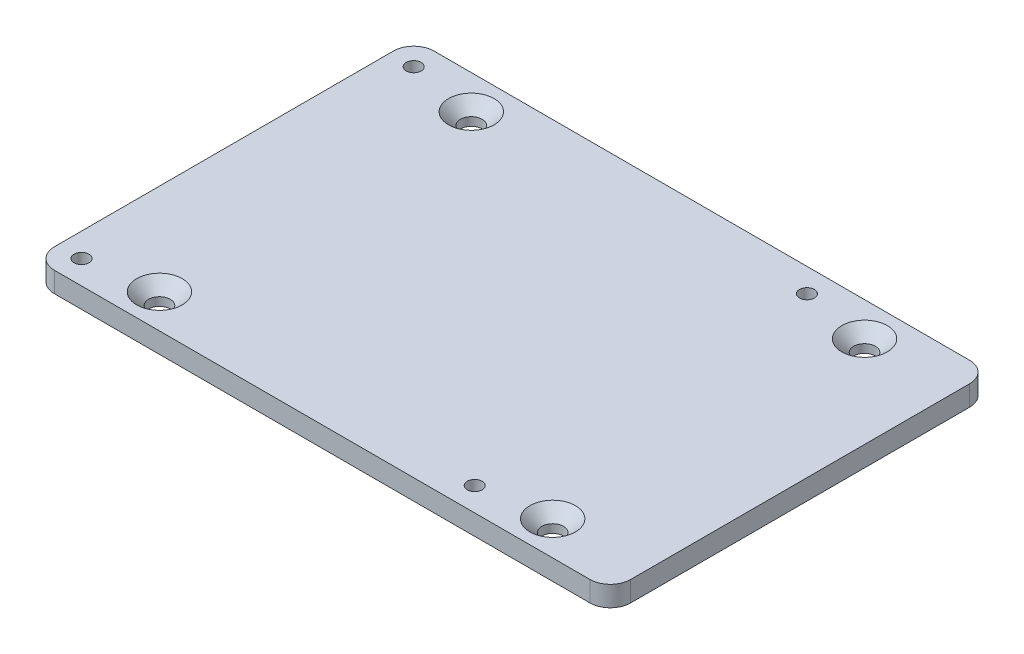
ISO-10303-21;
HEADER;
FILE_DESCRIPTION(('STEP AP214'),'2;1');
FILE_NAME('part.step','',(''),(''),'','','');
FILE_SCHEMA(('AUTOMOTIVE_DESIGN { 1 0 10303 214 1 1 1 1 }'));
ENDSEC;
DATA;
#1=APPLICATION_CONTEXT('core data for automotive mechanical design processes');
#2=APPLICATION_PROTOCOL_DEFINITION('international standard','automotive_design',2000,#1);
#3=PRODUCT_CONTEXT('',#1,'mechanical');
#4=PRODUCT('Part','Part','',(#3));
#5=PRODUCT_RELATED_PRODUCT_CATEGORY('part','',(#4));
#6=PRODUCT_DEFINITION_FORMATION('','',#4);
#7=PRODUCT_DEFINITION_CONTEXT('part definition',#1,'design');
#8=PRODUCT_DEFINITION('design','',#6,#7);
#9=PRODUCT_DEFINITION_SHAPE('','',#8);
#10=(LENGTH_UNIT() NAMED_UNIT(*) SI_UNIT(.MILLI.,.METRE.));
#11=(NAMED_UNIT(*) PLANE_ANGLE_UNIT() SI_UNIT($,.RADIAN.));
#12=(NAMED_UNIT(*) SI_UNIT($,.STERADIAN.) SOLID_ANGLE_UNIT());
#13=UNCERTAINTY_MEASURE_WITH_UNIT(LENGTH_MEASURE(1.E-05),#10,'distance_accuracy_value','');
#14=(GEOMETRIC_REPRESENTATION_CONTEXT(3) GLOBAL_UNCERTAINTY_ASSIGNED_CONTEXT((#13)) GLOBAL_UNIT_ASSIGNED_CONTEXT((#10,
#11,#12)) REPRESENTATION_CONTEXT('',''));
#15=CARTESIAN_POINT('',(0.,0.,0.));
#16=DIRECTION('',(0.,0.,1.));
#17=DIRECTION('',(1.,0.,0.));
#18=AXIS2_PLACEMENT_3D('',#15,#16,#17);
#19=CARTESIAN_POINT('',(-42.5,3.,28.));
#20=DIRECTION('',(1.,0.,0.));
#21=DIRECTION('',(0.,0.,-1.));
#22=AXIS2_PLACEMENT_3D('',#19,#20,#21);
#23=PLANE('',#22);
#24=DIRECTION('',(0.,0.,1.));
#25=VECTOR('',#24,1.);
#26=CARTESIAN_POINT('',(-42.5,0.,28.));
#27=LINE('',#26,#25);
#28=CARTESIAN_POINT('',(-42.5,0.,-25.));
#29=VERTEX_POINT('',#28);
#30=CARTESIAN_POINT('',(-42.5,0.,25.));
#31=VERTEX_POINT('',#30);
#32=EDGE_CURVE('E170',#29,#31,#27,.T.);
#33=ORIENTED_EDGE('',*,*,#32,.T.);
#34=DIRECTION('',(0.,-1.,0.));
#35=VECTOR('',#34,1.);
#36=CARTESIAN_POINT('',(-42.5,3.,25.));
#37=LINE('',#36,#35);
#38=CARTESIAN_POINT('',(-42.5,3.,25.));
#39=VERTEX_POINT('',#38);
#40=EDGE_CURVE('E11',#31,#39,#37,.F.);
#41=ORIENTED_EDGE('',*,*,#40,.T.);
#42=DIRECTION('',(0.,0.,1.));
#43=VECTOR('',#42,1.);
#44=CARTESIAN_POINT('',(-42.5,3.,28.));
#45=LINE('',#44,#43);
#46=CARTESIAN_POINT('',(-42.5,3.,-25.));
#47=VERTEX_POINT('',#46);
#48=EDGE_CURVE('E128',#47,#39,#45,.T.);
#49=ORIENTED_EDGE('',*,*,#48,.F.);
#50=DIRECTION('',(0.,-1.,0.));
#51=VECTOR('',#50,1.);
#52=CARTESIAN_POINT('',(-42.5,3.,-25.));
#53=LINE('',#52,#51);
#54=EDGE_CURVE('E44',#47,#29,#53,.T.);
#55=ORIENTED_EDGE('',*,*,#54,.T.);
#56=EDGE_LOOP('',(#33,#41,#49,#55));
#57=FACE_BOUND('',#56,.T.);
#58=ADVANCED_FACE('F36',(#57),#23,.F.);
#59=CARTESIAN_POINT('',(42.5,3.,28.));
#60=DIRECTION('',(0.,0.,-1.));
#61=DIRECTION('',(-1.,0.,0.));
#62=AXIS2_PLACEMENT_3D('',#59,#60,#61);
#63=PLANE('',#62);
#64=DIRECTION('',(1.,0.,0.));
#65=VECTOR('',#64,1.);
#66=CARTESIAN_POINT('',(42.5,0.,28.));
#67=LINE('',#66,#65);
#68=CARTESIAN_POINT('',(-39.5,0.,28.));
#69=VERTEX_POINT('',#68);
#70=CARTESIAN_POINT('',(39.5,0.,28.));
#71=VERTEX_POINT('',#70);
#72=EDGE_CURVE('E133',#69,#71,#67,.T.);
#73=ORIENTED_EDGE('',*,*,#72,.T.);
#74=DIRECTION('',(0.,-1.,0.));
#75=VECTOR('',#74,1.);
#76=CARTESIAN_POINT('',(39.5,3.,28.));
#77=LINE('',#76,#75);
#78=CARTESIAN_POINT('',(39.5,3.,28.));
#79=VERTEX_POINT('',#78);
#80=EDGE_CURVE('E51',#71,#79,#77,.F.);
#81=ORIENTED_EDGE('',*,*,#80,.T.);
#82=DIRECTION('',(1.,0.,0.));
#83=VECTOR('',#82,1.);
#84=CARTESIAN_POINT('',(42.5,3.,28.));
#85=LINE('',#84,#83);
#86=CARTESIAN_POINT('',(-39.5,3.,28.));
#87=VERTEX_POINT('',#86);
#88=EDGE_CURVE('E131',#87,#79,#85,.T.);
#89=ORIENTED_EDGE('',*,*,#88,.F.);
#90=DIRECTION('',(0.,-1.,0.));
#91=VECTOR('',#90,1.);
#92=CARTESIAN_POINT('',(-39.5,3.,28.));
#93=LINE('',#92,#91);
#94=EDGE_CURVE('E162',#87,#69,#93,.T.);
#95=ORIENTED_EDGE('',*,*,#94,.T.);
#96=EDGE_LOOP('',(#73,#81,#89,#95));
#97=FACE_BOUND('',#96,.T.);
#98=ADVANCED_FACE('F259',(#97),#63,.F.);
#99=CARTESIAN_POINT('',(42.5,3.,28.));
#100=DIRECTION('',(-1.,0.,0.));
#101=DIRECTION('',(0.,0.,1.));
#102=AXIS2_PLACEMENT_3D('',#99,#100,#101);
#103=PLANE('',#102);
#104=DIRECTION('',(0.,0.,-1.));
#105=VECTOR('',#104,1.);
#106=CARTESIAN_POINT('',(42.5,0.,28.));
#107=LINE('',#106,#105);
#108=CARTESIAN_POINT('',(42.5,0.,25.));
#109=VERTEX_POINT('',#108);
#110=CARTESIAN_POINT('',(42.5,0.,-25.));
#111=VERTEX_POINT('',#110);
#112=EDGE_CURVE('E129',#109,#111,#107,.T.);
#113=ORIENTED_EDGE('',*,*,#112,.T.);
#114=DIRECTION('',(0.,-1.,0.));
#115=VECTOR('',#114,1.);
#116=CARTESIAN_POINT('',(42.5,3.,-25.));
#117=LINE('',#116,#115);
#118=CARTESIAN_POINT('',(42.5,3.,-25.));
#119=VERTEX_POINT('',#118);
#120=EDGE_CURVE('E107',#111,#119,#117,.F.);
#121=ORIENTED_EDGE('',*,*,#120,.T.);
#122=DIRECTION('',(0.,0.,-1.));
#123=VECTOR('',#122,1.);
#124=CARTESIAN_POINT('',(42.5,3.,28.));
#125=LINE('',#124,#123);
#126=CARTESIAN_POINT('',(42.5,3.,25.));
#127=VERTEX_POINT('',#126);
#128=EDGE_CURVE('E181',#127,#119,#125,.T.);
#129=ORIENTED_EDGE('',*,*,#128,.F.);
#130=DIRECTION('',(0.,-1.,0.));
#131=VECTOR('',#130,1.);
#132=CARTESIAN_POINT('',(42.5,3.,25.));
#133=LINE('',#132,#131);
#134=EDGE_CURVE('E112',#127,#109,#133,.T.);
#135=ORIENTED_EDGE('',*,*,#134,.T.);
#136=EDGE_LOOP('',(#113,#121,#129,#135));
#137=FACE_BOUND('',#136,.T.);
#138=ADVANCED_FACE('F256',(#137),#103,.F.);
#139=CARTESIAN_POINT('',(42.5,3.,-28.));
#140=DIRECTION('',(0.,0.,1.));
#141=DIRECTION('',(1.,0.,0.));
#142=AXIS2_PLACEMENT_3D('',#139,#140,#141);
#143=PLANE('',#142);
#144=DIRECTION('',(-1.,0.,0.));
#145=VECTOR('',#144,1.);
#146=CARTESIAN_POINT('',(42.5,3.,-28.));
#147=LINE('',#146,#145);
#148=CARTESIAN_POINT('',(39.5,3.,-28.));
#149=VERTEX_POINT('',#148);
#150=CARTESIAN_POINT('',(-39.5,3.,-28.));
#151=VERTEX_POINT('',#150);
#152=EDGE_CURVE('E122',#149,#151,#147,.T.);
#153=ORIENTED_EDGE('',*,*,#152,.F.);
#154=DIRECTION('',(0.,-1.,0.));
#155=VECTOR('',#154,1.);
#156=CARTESIAN_POINT('',(39.5,3.,-28.));
#157=LINE('',#156,#155);
#158=CARTESIAN_POINT('',(39.5,0.,-28.));
#159=VERTEX_POINT('',#158);
#160=EDGE_CURVE('E106',#149,#159,#157,.T.);
#161=ORIENTED_EDGE('',*,*,#160,.T.);
#162=DIRECTION('',(-1.,0.,0.));
#163=VECTOR('',#162,1.);
#164=CARTESIAN_POINT('',(42.5,0.,-28.));
#165=LINE('',#164,#163);
#166=CARTESIAN_POINT('',(-39.5,0.,-28.));
#167=VERTEX_POINT('',#166);
#168=EDGE_CURVE('E119',#159,#167,#165,.T.);
#169=ORIENTED_EDGE('',*,*,#168,.T.);
#170=DIRECTION('',(0.,-1.,0.));
#171=VECTOR('',#170,1.);
#172=CARTESIAN_POINT('',(-39.5,3.,-28.));
#173=LINE('',#172,#171);
#174=EDGE_CURVE('E124',#167,#151,#173,.F.);
#175=ORIENTED_EDGE('',*,*,#174,.T.);
#176=EDGE_LOOP('',(#153,#161,#169,#175));
#177=FACE_BOUND('',#176,.T.);
#178=ADVANCED_FACE('F118',(#177),#143,.F.);
#179=CARTESIAN_POINT('',(0.,3.,0.));
#180=DIRECTION('',(0.,1.,0.));
#181=DIRECTION('',(0.,0.,1.));
#182=AXIS2_PLACEMENT_3D('',#179,#180,#181);
#183=PLANE('',#182);
#184=CARTESIAN_POINT('',(-29.,3.,-23.));
#185=DIRECTION('',(0.,1.,0.));
#186=DIRECTION('',(0.,0.,1.));
#187=AXIS2_PLACEMENT_3D('',#184,#185,#186);
#188=CIRCLE('',#187,3.36);
#189=CARTESIAN_POINT('',(-29.,3.,-19.64));
#190=VERTEX_POINT('',#189);
#191=EDGE_CURVE('E229',#190,#190,#188,.T.);
#192=ORIENTED_EDGE('',*,*,#191,.F.);
#193=EDGE_LOOP('',(#192));
#194=FACE_BOUND('',#193,.T.);
#195=CARTESIAN_POINT('',(29.,3.,23.));
#196=DIRECTION('',(0.,1.,0.));
#197=DIRECTION('',(0.,0.,1.));
#198=AXIS2_PLACEMENT_3D('',#195,#196,#197);
#199=CIRCLE('',#198,3.36);
#200=CARTESIAN_POINT('',(29.,3.,26.36));
#201=VERTEX_POINT('',#200);
#202=EDGE_CURVE('E220',#201,#201,#199,.T.);
#203=ORIENTED_EDGE('',*,*,#202,.F.);
#204=EDGE_LOOP('',(#203));
#205=FACE_BOUND('',#204,.T.);
#206=CARTESIAN_POINT('',(-29.,3.,23.));
#207=DIRECTION('',(0.,1.,0.));
#208=DIRECTION('',(0.,0.,1.));
#209=AXIS2_PLACEMENT_3D('',#206,#207,#208);
#210=CIRCLE('',#209,3.36);
#211=CARTESIAN_POINT('',(-29.,3.,26.36));
#212=VERTEX_POINT('',#211);
#213=EDGE_CURVE('E211',#212,#212,#210,.T.);
#214=ORIENTED_EDGE('',*,*,#213,.F.);
#215=EDGE_LOOP('',(#214));
#216=FACE_BOUND('',#215,.T.);
#217=CARTESIAN_POINT('',(29.,3.,-23.));
#218=DIRECTION('',(0.,1.,0.));
#219=DIRECTION('',(0.,0.,1.));
#220=AXIS2_PLACEMENT_3D('',#217,#218,#219);
#221=CIRCLE('',#220,3.36);
#222=CARTESIAN_POINT('',(29.,3.,-19.64));
#223=VERTEX_POINT('',#222);
#224=EDGE_CURVE('E202',#223,#223,#221,.T.);
#225=ORIENTED_EDGE('',*,*,#224,.F.);
#226=EDGE_LOOP('',(#225));
#227=FACE_BOUND('',#226,.T.);
#228=CARTESIAN_POINT('',(-39.,3.,-24.5));
#229=DIRECTION('',(0.,1.,0.));
#230=DIRECTION('',(0.,0.,1.));
#231=AXIS2_PLACEMENT_3D('',#228,#229,#230);
#232=CIRCLE('',#231,1.1);
#233=CARTESIAN_POINT('',(-39.,3.,-23.4));
#234=VERTEX_POINT('',#233);
#235=EDGE_CURVE('E146',#234,#234,#232,.T.);
#236=ORIENTED_EDGE('',*,*,#235,.F.);
#237=EDGE_LOOP('',(#236));
#238=FACE_BOUND('',#237,.T.);
#239=CARTESIAN_POINT('',(19.,3.,24.5));
#240=DIRECTION('',(0.,1.,0.));
#241=DIRECTION('',(0.,0.,1.));
#242=AXIS2_PLACEMENT_3D('',#239,#240,#241);
#243=CIRCLE('',#242,1.1);
#244=CARTESIAN_POINT('',(19.,3.,25.6));
#245=VERTEX_POINT('',#244);
#246=EDGE_CURVE('E145',#245,#245,#243,.T.);
#247=ORIENTED_EDGE('',*,*,#246,.F.);
#248=EDGE_LOOP('',(#247));
#249=FACE_BOUND('',#248,.T.);
#250=CARTESIAN_POINT('',(19.,3.,-24.5));
#251=DIRECTION('',(0.,1.,0.));
#252=DIRECTION('',(0.,0.,1.));
#253=AXIS2_PLACEMENT_3D('',#250,#251,#252);
#254=CIRCLE('',#253,1.1);
#255=CARTESIAN_POINT('',(19.,3.,-23.4));
#256=VERTEX_POINT('',#255);
#257=EDGE_CURVE('E141',#256,#256,#254,.T.);
#258=ORIENTED_EDGE('',*,*,#257,.F.);
#259=EDGE_LOOP('',(#258));
#260=FACE_BOUND('',#259,.T.);
#261=CARTESIAN_POINT('',(-39.,3.,24.5));
#262=DIRECTION('',(0.,1.,0.));
#263=DIRECTION('',(0.,0.,1.));
#264=AXIS2_PLACEMENT_3D('',#261,#262,#263);
#265=CIRCLE('',#264,1.1);
#266=CARTESIAN_POINT('',(-39.,3.,25.6));
#267=VERTEX_POINT('',#266);
#268=EDGE_CURVE('E140',#267,#267,#265,.T.);
#269=ORIENTED_EDGE('',*,*,#268,.F.);
#270=EDGE_LOOP('',(#269));
#271=FACE_BOUND('',#270,.T.);
#272=ORIENTED_EDGE('',*,*,#128,.T.);
#273=CARTESIAN_POINT('',(39.5,3.,-25.));
#274=DIRECTION('',(0.,1.,0.));
#275=DIRECTION('',(0.,0.,1.));
#276=AXIS2_PLACEMENT_3D('',#273,#274,#275);
#277=CIRCLE('',#276,3.);
#278=EDGE_CURVE('E160',#119,#149,#277,.T.);
#279=ORIENTED_EDGE('',*,*,#278,.T.);
#280=ORIENTED_EDGE('',*,*,#152,.T.);
#281=CARTESIAN_POINT('',(-39.5,3.,-25.));
#282=DIRECTION('',(0.,1.,0.));
#283=DIRECTION('',(0.,0.,1.));
#284=AXIS2_PLACEMENT_3D('',#281,#282,#283);
#285=CIRCLE('',#284,3.);
#286=EDGE_CURVE('E155',#151,#47,#285,.T.);
#287=ORIENTED_EDGE('',*,*,#286,.T.);
#288=ORIENTED_EDGE('',*,*,#48,.T.);
#289=CARTESIAN_POINT('',(-39.5,3.,25.));
#290=DIRECTION('',(0.,1.,0.));
#291=DIRECTION('',(0.,0.,1.));
#292=AXIS2_PLACEMENT_3D('',#289,#290,#291);
#293=CIRCLE('',#292,3.);
#294=EDGE_CURVE('E58',#39,#87,#293,.T.);
#295=ORIENTED_EDGE('',*,*,#294,.T.);
#296=ORIENTED_EDGE('',*,*,#88,.T.);
#297=CARTESIAN_POINT('',(39.5,3.,25.));
#298=DIRECTION('',(0.,1.,0.));
#299=DIRECTION('',(0.,0.,1.));
#300=AXIS2_PLACEMENT_3D('',#297,#298,#299);
#301=CIRCLE('',#300,3.);
#302=EDGE_CURVE('E158',#79,#127,#301,.T.);
#303=ORIENTED_EDGE('',*,*,#302,.T.);
#304=EDGE_LOOP('',(#272,#279,#280,#287,#288,#295,#296,#303));
#305=FACE_BOUND('',#304,.T.);
#306=ADVANCED_FACE('F235',(#194,#205,#216,#227,#238,#249,#260,#271,#305),#183,.T.);
#307=CARTESIAN_POINT('',(0.,0.,0.));
#308=DIRECTION('',(0.,1.,0.));
#309=DIRECTION('',(0.,0.,1.));
#310=AXIS2_PLACEMENT_3D('',#307,#308,#309);
#311=PLANE('',#310);
#312=CARTESIAN_POINT('',(-29.,0.,-23.));
#313=DIRECTION('',(0.,1.,0.));
#314=DIRECTION('',(0.,0.,1.));
#315=AXIS2_PLACEMENT_3D('',#312,#313,#314);
#316=CIRCLE('',#315,1.6);
#317=CARTESIAN_POINT('',(-29.,0.,-21.4));
#318=VERTEX_POINT('',#317);
#319=EDGE_CURVE('E223',#318,#318,#316,.T.);
#320=ORIENTED_EDGE('',*,*,#319,.T.);
#321=EDGE_LOOP('',(#320));
#322=FACE_BOUND('',#321,.T.);
#323=CARTESIAN_POINT('',(29.,0.,23.));
#324=DIRECTION('',(0.,1.,0.));
#325=DIRECTION('',(0.,0.,1.));
#326=AXIS2_PLACEMENT_3D('',#323,#324,#325);
#327=CIRCLE('',#326,1.6);
#328=CARTESIAN_POINT('',(29.,0.,24.6));
#329=VERTEX_POINT('',#328);
#330=EDGE_CURVE('E214',#329,#329,#327,.T.);
#331=ORIENTED_EDGE('',*,*,#330,.T.);
#332=EDGE_LOOP('',(#331));
#333=FACE_BOUND('',#332,.T.);
#334=CARTESIAN_POINT('',(-29.,0.,23.));
#335=DIRECTION('',(0.,1.,0.));
#336=DIRECTION('',(0.,0.,1.));
#337=AXIS2_PLACEMENT_3D('',#334,#335,#336);
#338=CIRCLE('',#337,1.6);
#339=CARTESIAN_POINT('',(-29.,0.,24.6));
#340=VERTEX_POINT('',#339);
#341=EDGE_CURVE('E205',#340,#340,#338,.T.);
#342=ORIENTED_EDGE('',*,*,#341,.T.);
#343=EDGE_LOOP('',(#342));
#344=FACE_BOUND('',#343,.T.);
#345=CARTESIAN_POINT('',(29.,0.,-23.));
#346=DIRECTION('',(0.,1.,0.));
#347=DIRECTION('',(0.,0.,1.));
#348=AXIS2_PLACEMENT_3D('',#345,#346,#347);
#349=CIRCLE('',#348,1.6);
#350=CARTESIAN_POINT('',(29.,0.,-21.4));
#351=VERTEX_POINT('',#350);
#352=EDGE_CURVE('E196',#351,#351,#349,.T.);
#353=ORIENTED_EDGE('',*,*,#352,.T.);
#354=EDGE_LOOP('',(#353));
#355=FACE_BOUND('',#354,.T.);
#356=CARTESIAN_POINT('',(-39.,0.,-24.5));
#357=DIRECTION('',(0.,1.,0.));
#358=DIRECTION('',(0.,0.,1.));
#359=AXIS2_PLACEMENT_3D('',#356,#357,#358);
#360=CIRCLE('',#359,1.1);
#361=CARTESIAN_POINT('',(-39.,0.,-23.4));
#362=VERTEX_POINT('',#361);
#363=EDGE_CURVE('E142',#362,#362,#360,.T.);
#364=ORIENTED_EDGE('',*,*,#363,.T.);
#365=EDGE_LOOP('',(#364));
#366=FACE_BOUND('',#365,.T.);
#367=CARTESIAN_POINT('',(19.,0.,24.5));
#368=DIRECTION('',(0.,1.,0.));
#369=DIRECTION('',(0.,0.,1.));
#370=AXIS2_PLACEMENT_3D('',#367,#368,#369);
#371=CIRCLE('',#370,1.1);
#372=CARTESIAN_POINT('',(19.,0.,25.6));
#373=VERTEX_POINT('',#372);
#374=EDGE_CURVE('E189',#373,#373,#371,.T.);
#375=ORIENTED_EDGE('',*,*,#374,.T.);
#376=EDGE_LOOP('',(#375));
#377=FACE_BOUND('',#376,.T.);
#378=CARTESIAN_POINT('',(19.,0.,-24.5));
#379=DIRECTION('',(0.,1.,0.));
#380=DIRECTION('',(0.,0.,1.));
#381=AXIS2_PLACEMENT_3D('',#378,#379,#380);
#382=CIRCLE('',#381,1.1);
#383=CARTESIAN_POINT('',(19.,0.,-23.4));
#384=VERTEX_POINT('',#383);
#385=EDGE_CURVE('E137',#384,#384,#382,.T.);
#386=ORIENTED_EDGE('',*,*,#385,.T.);
#387=EDGE_LOOP('',(#386));
#388=FACE_BOUND('',#387,.T.);
#389=CARTESIAN_POINT('',(-39.,0.,24.5));
#390=DIRECTION('',(0.,1.,0.));
#391=DIRECTION('',(0.,0.,1.));
#392=AXIS2_PLACEMENT_3D('',#389,#390,#391);
#393=CIRCLE('',#392,1.1);
#394=CARTESIAN_POINT('',(-39.,0.,25.6));
#395=VERTEX_POINT('',#394);
#396=EDGE_CURVE('E175',#395,#395,#393,.T.);
#397=ORIENTED_EDGE('',*,*,#396,.T.);
#398=EDGE_LOOP('',(#397));
#399=FACE_BOUND('',#398,.T.);
#400=ORIENTED_EDGE('',*,*,#168,.F.);
#401=CARTESIAN_POINT('',(39.5,0.,-25.));
#402=DIRECTION('',(0.,1.,0.));
#403=DIRECTION('',(0.,0.,1.));
#404=AXIS2_PLACEMENT_3D('',#401,#402,#403);
#405=CIRCLE('',#404,3.);
#406=EDGE_CURVE('E102',#159,#111,#405,.F.);
#407=ORIENTED_EDGE('',*,*,#406,.T.);
#408=ORIENTED_EDGE('',*,*,#112,.F.);
#409=CARTESIAN_POINT('',(39.5,0.,25.));
#410=DIRECTION('',(0.,1.,0.));
#411=DIRECTION('',(0.,0.,1.));
#412=AXIS2_PLACEMENT_3D('',#409,#410,#411);
#413=CIRCLE('',#412,3.);
#414=EDGE_CURVE('E113',#109,#71,#413,.F.);
#415=ORIENTED_EDGE('',*,*,#414,.T.);
#416=ORIENTED_EDGE('',*,*,#72,.F.);
#417=CARTESIAN_POINT('',(-39.5,0.,25.));
#418=DIRECTION('',(0.,1.,0.));
#419=DIRECTION('',(0.,0.,1.));
#420=AXIS2_PLACEMENT_3D('',#417,#418,#419);
#421=CIRCLE('',#420,3.);
#422=EDGE_CURVE('E149',#69,#31,#421,.F.);
#423=ORIENTED_EDGE('',*,*,#422,.T.);
#424=ORIENTED_EDGE('',*,*,#32,.F.);
#425=CARTESIAN_POINT('',(-39.5,0.,-25.));
#426=DIRECTION('',(0.,1.,0.));
#427=DIRECTION('',(0.,0.,1.));
#428=AXIS2_PLACEMENT_3D('',#425,#426,#427);
#429=CIRCLE('',#428,3.);
#430=EDGE_CURVE('E123',#29,#167,#429,.F.);
#431=ORIENTED_EDGE('',*,*,#430,.T.);
#432=EDGE_LOOP('',(#400,#407,#408,#415,#416,#423,#424,#431));
#433=FACE_BOUND('',#432,.T.);
#434=ADVANCED_FACE('F126',(#322,#333,#344,#355,#366,#377,#388,#399,#433),#311,.F.);
#435=CARTESIAN_POINT('',(-39.,3.,24.5));
#436=DIRECTION('',(0.,1.,0.));
#437=DIRECTION('',(0.,0.,1.));
#438=AXIS2_PLACEMENT_3D('',#435,#436,#437);
#439=CYLINDRICAL_SURFACE('',#438,1.1);
#440=ORIENTED_EDGE('',*,*,#268,.T.);
#441=EDGE_LOOP('',(#440));
#442=FACE_BOUND('',#441,.T.);
#443=ORIENTED_EDGE('',*,*,#396,.F.);
#444=EDGE_LOOP('',(#443));
#445=FACE_BOUND('',#444,.T.);
#446=ADVANCED_FACE('F313',(#442,#445),#439,.F.);
#447=CARTESIAN_POINT('',(19.,3.,-24.5));
#448=DIRECTION('',(0.,1.,0.));
#449=DIRECTION('',(0.,0.,1.));
#450=AXIS2_PLACEMENT_3D('',#447,#448,#449);
#451=CYLINDRICAL_SURFACE('',#450,1.1);
#452=ORIENTED_EDGE('',*,*,#257,.T.);
#453=EDGE_LOOP('',(#452));
#454=FACE_BOUND('',#453,.T.);
#455=ORIENTED_EDGE('',*,*,#385,.F.);
#456=EDGE_LOOP('',(#455));
#457=FACE_BOUND('',#456,.T.);
#458=ADVANCED_FACE('F432',(#454,#457),#451,.F.);
#459=CARTESIAN_POINT('',(19.,3.,24.5));
#460=DIRECTION('',(0.,1.,0.));
#461=DIRECTION('',(0.,0.,1.));
#462=AXIS2_PLACEMENT_3D('',#459,#460,#461);
#463=CYLINDRICAL_SURFACE('',#462,1.1);
#464=ORIENTED_EDGE('',*,*,#246,.T.);
#465=EDGE_LOOP('',(#464));
#466=FACE_BOUND('',#465,.T.);
#467=ORIENTED_EDGE('',*,*,#374,.F.);
#468=EDGE_LOOP('',(#467));
#469=FACE_BOUND('',#468,.T.);
#470=ADVANCED_FACE('F422',(#466,#469),#463,.F.);
#471=CARTESIAN_POINT('',(-39.,3.,-24.5));
#472=DIRECTION('',(0.,1.,0.));
#473=DIRECTION('',(0.,0.,1.));
#474=AXIS2_PLACEMENT_3D('',#471,#472,#473);
#475=CYLINDRICAL_SURFACE('',#474,1.1);
#476=ORIENTED_EDGE('',*,*,#235,.T.);
#477=EDGE_LOOP('',(#476));
#478=FACE_BOUND('',#477,.T.);
#479=ORIENTED_EDGE('',*,*,#363,.F.);
#480=EDGE_LOOP('',(#479));
#481=FACE_BOUND('',#480,.T.);
#482=ADVANCED_FACE('F282',(#478,#481),#475,.F.);
#483=CARTESIAN_POINT('',(39.5,3.,-25.));
#484=DIRECTION('',(0.,-1.,0.));
#485=DIRECTION('',(0.,0.,-1.));
#486=AXIS2_PLACEMENT_3D('',#483,#484,#485);
#487=CYLINDRICAL_SURFACE('',#486,3.);
#488=ORIENTED_EDGE('',*,*,#278,.F.);
#489=ORIENTED_EDGE('',*,*,#120,.F.);
#490=ORIENTED_EDGE('',*,*,#406,.F.);
#491=ORIENTED_EDGE('',*,*,#160,.F.);
#492=EDGE_LOOP('',(#488,#489,#490,#491));
#493=FACE_BOUND('',#492,.T.);
#494=ADVANCED_FACE('F105',(#493),#487,.T.);
#495=CARTESIAN_POINT('',(39.5,3.,25.));
#496=DIRECTION('',(0.,-1.,0.));
#497=DIRECTION('',(0.,0.,-1.));
#498=AXIS2_PLACEMENT_3D('',#495,#496,#497);
#499=CYLINDRICAL_SURFACE('',#498,3.);
#500=ORIENTED_EDGE('',*,*,#302,.F.);
#501=ORIENTED_EDGE('',*,*,#80,.F.);
#502=ORIENTED_EDGE('',*,*,#414,.F.);
#503=ORIENTED_EDGE('',*,*,#134,.F.);
#504=EDGE_LOOP('',(#500,#501,#502,#503));
#505=FACE_BOUND('',#504,.T.);
#506=ADVANCED_FACE('F258',(#505),#499,.T.);
#507=CARTESIAN_POINT('',(-39.5,3.,25.));
#508=DIRECTION('',(0.,-1.,0.));
#509=DIRECTION('',(0.,0.,-1.));
#510=AXIS2_PLACEMENT_3D('',#507,#508,#509);
#511=CYLINDRICAL_SURFACE('',#510,3.);
#512=ORIENTED_EDGE('',*,*,#294,.F.);
#513=ORIENTED_EDGE('',*,*,#40,.F.);
#514=ORIENTED_EDGE('',*,*,#422,.F.);
#515=ORIENTED_EDGE('',*,*,#94,.F.);
#516=EDGE_LOOP('',(#512,#513,#514,#515));
#517=FACE_BOUND('',#516,.T.);
#518=ADVANCED_FACE('F262',(#517),#511,.T.);
#519=CARTESIAN_POINT('',(-39.5,3.,-25.));
#520=DIRECTION('',(0.,-1.,0.));
#521=DIRECTION('',(0.,0.,-1.));
#522=AXIS2_PLACEMENT_3D('',#519,#520,#521);
#523=CYLINDRICAL_SURFACE('',#522,3.);
#524=ORIENTED_EDGE('',*,*,#286,.F.);
#525=ORIENTED_EDGE('',*,*,#174,.F.);
#526=ORIENTED_EDGE('',*,*,#430,.F.);
#527=ORIENTED_EDGE('',*,*,#54,.F.);
#528=EDGE_LOOP('',(#524,#525,#526,#527));
#529=FACE_BOUND('',#528,.T.);
#530=ADVANCED_FACE('F38',(#529),#523,.T.);
#531=CARTESIAN_POINT('',(29.,3.,-23.));
#532=DIRECTION('',(0.,1.,0.));
#533=DIRECTION('',(0.,0.,1.));
#534=AXIS2_PLACEMENT_3D('',#531,#532,#533);
#535=CYLINDRICAL_SURFACE('',#534,1.6);
#536=ORIENTED_EDGE('',*,*,#352,.F.);
#537=EDGE_LOOP('',(#536));
#538=FACE_BOUND('',#537,.T.);
#539=CARTESIAN_POINT('',(29.,1.24,-23.));
#540=DIRECTION('',(0.,1.,0.));
#541=DIRECTION('',(0.,0.,1.));
#542=AXIS2_PLACEMENT_3D('',#539,#540,#541);
#543=CIRCLE('',#542,1.6);
#544=CARTESIAN_POINT('',(29.,1.24,-21.4));
#545=VERTEX_POINT('',#544);
#546=EDGE_CURVE('E199',#545,#545,#543,.T.);
#547=ORIENTED_EDGE('',*,*,#546,.T.);
#548=EDGE_LOOP('',(#547));
#549=FACE_BOUND('',#548,.T.);
#550=ADVANCED_FACE('F264',(#538,#549),#535,.F.);
#551=CARTESIAN_POINT('',(29.,3.,-23.));
#552=DIRECTION('',(0.,1.,0.));
#553=DIRECTION('',(0.,0.,1.));
#554=AXIS2_PLACEMENT_3D('',#551,#552,#553);
#555=CONICAL_SURFACE('',#554,3.36,0.785398163397448);
#556=ORIENTED_EDGE('',*,*,#546,.F.);
#557=EDGE_LOOP('',(#556));
#558=FACE_BOUND('',#557,.T.);
#559=ORIENTED_EDGE('',*,*,#224,.T.);
#560=EDGE_LOOP('',(#559));
#561=FACE_BOUND('',#560,.T.);
#562=ADVANCED_FACE('F269',(#558,#561),#555,.F.);
#563=CARTESIAN_POINT('',(-29.,3.,23.));
#564=DIRECTION('',(0.,1.,0.));
#565=DIRECTION('',(0.,0.,1.));
#566=AXIS2_PLACEMENT_3D('',#563,#564,#565);
#567=CYLINDRICAL_SURFACE('',#566,1.6);
#568=ORIENTED_EDGE('',*,*,#341,.F.);
#569=EDGE_LOOP('',(#568));
#570=FACE_BOUND('',#569,.T.);
#571=CARTESIAN_POINT('',(-29.,1.24,23.));
#572=DIRECTION('',(0.,1.,0.));
#573=DIRECTION('',(0.,0.,1.));
#574=AXIS2_PLACEMENT_3D('',#571,#572,#573);
#575=CIRCLE('',#574,1.6);
#576=CARTESIAN_POINT('',(-29.,1.24,24.6));
#577=VERTEX_POINT('',#576);
#578=EDGE_CURVE('E208',#577,#577,#575,.T.);
#579=ORIENTED_EDGE('',*,*,#578,.T.);
#580=EDGE_LOOP('',(#579));
#581=FACE_BOUND('',#580,.T.);
#582=ADVANCED_FACE('F329',(#570,#581),#567,.F.);
#583=CARTESIAN_POINT('',(-29.,3.,23.));
#584=DIRECTION('',(0.,1.,0.));
#585=DIRECTION('',(0.,0.,1.));
#586=AXIS2_PLACEMENT_3D('',#583,#584,#585);
#587=CONICAL_SURFACE('',#586,3.36,0.785398163397448);
#588=ORIENTED_EDGE('',*,*,#578,.F.);
#589=EDGE_LOOP('',(#588));
#590=FACE_BOUND('',#589,.T.);
#591=ORIENTED_EDGE('',*,*,#213,.T.);
#592=EDGE_LOOP('',(#591));
#593=FACE_BOUND('',#592,.T.);
#594=ADVANCED_FACE('F340',(#590,#593),#587,.F.);
#595=CARTESIAN_POINT('',(29.,3.,23.));
#596=DIRECTION('',(0.,1.,0.));
#597=DIRECTION('',(0.,0.,1.));
#598=AXIS2_PLACEMENT_3D('',#595,#596,#597);
#599=CYLINDRICAL_SURFACE('',#598,1.6);
#600=ORIENTED_EDGE('',*,*,#330,.F.);
#601=EDGE_LOOP('',(#600));
#602=FACE_BOUND('',#601,.T.);
#603=CARTESIAN_POINT('',(29.,1.24,23.));
#604=DIRECTION('',(0.,1.,0.));
#605=DIRECTION('',(0.,0.,1.));
#606=AXIS2_PLACEMENT_3D('',#603,#604,#605);
#607=CIRCLE('',#606,1.6);
#608=CARTESIAN_POINT('',(29.,1.24,24.6));
#609=VERTEX_POINT('',#608);
#610=EDGE_CURVE('E217',#609,#609,#607,.T.);
#611=ORIENTED_EDGE('',*,*,#610,.T.);
#612=EDGE_LOOP('',(#611));
#613=FACE_BOUND('',#612,.T.);
#614=ADVANCED_FACE('F351',(#602,#613),#599,.F.);
#615=CARTESIAN_POINT('',(29.,3.,23.));
#616=DIRECTION('',(0.,1.,0.));
#617=DIRECTION('',(0.,0.,1.));
#618=AXIS2_PLACEMENT_3D('',#615,#616,#617);
#619=CONICAL_SURFACE('',#618,3.36,0.785398163397448);
#620=ORIENTED_EDGE('',*,*,#610,.F.);
#621=EDGE_LOOP('',(#620));
#622=FACE_BOUND('',#621,.T.);
#623=ORIENTED_EDGE('',*,*,#202,.T.);
#624=EDGE_LOOP('',(#623));
#625=FACE_BOUND('',#624,.T.);
#626=ADVANCED_FACE('F362',(#622,#625),#619,.F.);
#627=CARTESIAN_POINT('',(-29.,3.,-23.));
#628=DIRECTION('',(0.,1.,0.));
#629=DIRECTION('',(0.,0.,1.));
#630=AXIS2_PLACEMENT_3D('',#627,#628,#629);
#631=CYLINDRICAL_SURFACE('',#630,1.6);
#632=ORIENTED_EDGE('',*,*,#319,.F.);
#633=EDGE_LOOP('',(#632));
#634=FACE_BOUND('',#633,.T.);
#635=CARTESIAN_POINT('',(-29.,1.24,-23.));
#636=DIRECTION('',(0.,1.,0.));
#637=DIRECTION('',(0.,0.,1.));
#638=AXIS2_PLACEMENT_3D('',#635,#636,#637);
#639=CIRCLE('',#638,1.6);
#640=CARTESIAN_POINT('',(-29.,1.24,-21.4));
#641=VERTEX_POINT('',#640);
#642=EDGE_CURVE('E226',#641,#641,#639,.T.);
#643=ORIENTED_EDGE('',*,*,#642,.T.);
#644=EDGE_LOOP('',(#643));
#645=FACE_BOUND('',#644,.T.);
#646=ADVANCED_FACE('F373',(#634,#645),#631,.F.);
#647=CARTESIAN_POINT('',(-29.,3.,-23.));
#648=DIRECTION('',(0.,1.,0.));
#649=DIRECTION('',(0.,0.,1.));
#650=AXIS2_PLACEMENT_3D('',#647,#648,#649);
#651=CONICAL_SURFACE('',#650,3.36,0.785398163397448);
#652=ORIENTED_EDGE('',*,*,#642,.F.);
#653=EDGE_LOOP('',(#652));
#654=FACE_BOUND('',#653,.T.);
#655=ORIENTED_EDGE('',*,*,#191,.T.);
#656=EDGE_LOOP('',(#655));
#657=FACE_BOUND('',#656,.T.);
#658=ADVANCED_FACE('F233',(#654,#657),#651,.F.);
#659=CLOSED_SHELL('',(#58,#98,#138,#178,#306,#434,#446,#458,#470,#482,#494,#506,#518,#530,#550,
#562,#582,#594,#614,#626,#646,#658));
#660=MANIFOLD_SOLID_BREP('B2',#659);
#661=ADVANCED_BREP_SHAPE_REPRESENTATION('',(#18,#660),#14);
#662=SHAPE_DEFINITION_REPRESENTATION(#9,#661);
ENDSEC;
END-ISO-10303-21;
